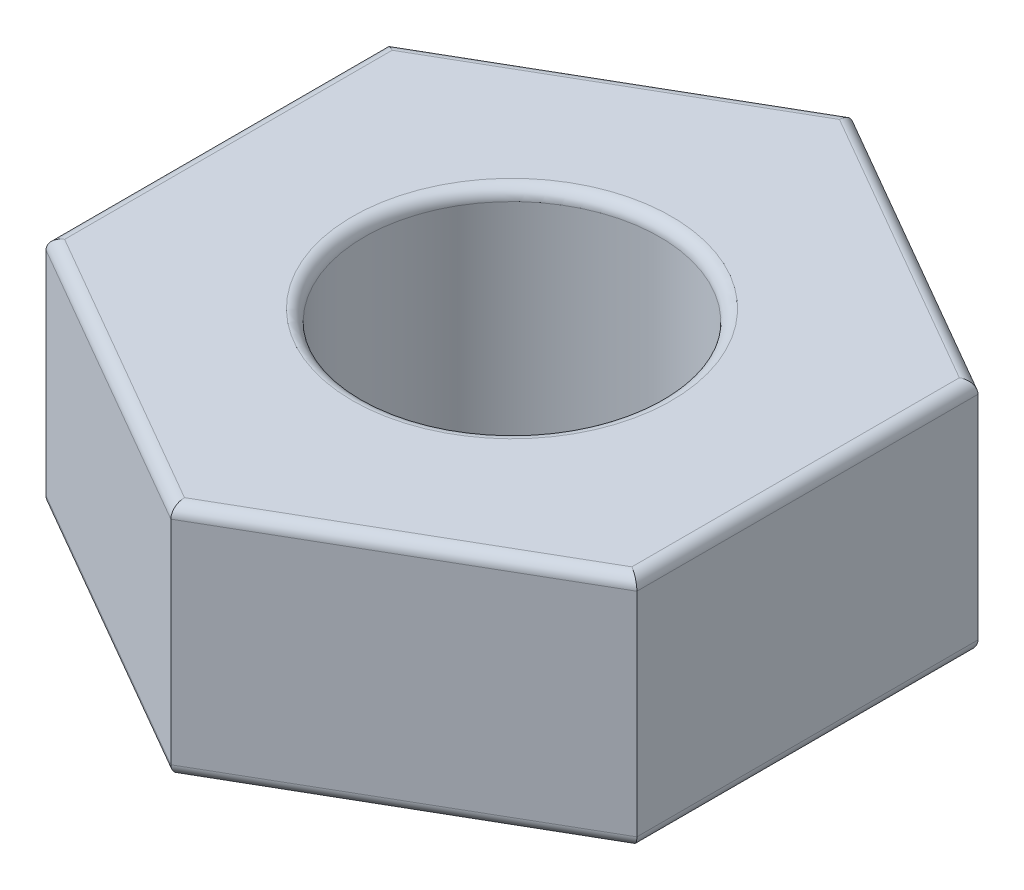
ISO-10303-21;
HEADER;
FILE_DESCRIPTION(('STEP AP214'),'2;1');
FILE_NAME('part.step','',(''),(''),'','','');
FILE_SCHEMA(('AUTOMOTIVE_DESIGN { 1 0 10303 214 1 1 1 1 }'));
ENDSEC;
DATA;
#1=APPLICATION_CONTEXT('core data for automotive mechanical design processes');
#2=APPLICATION_PROTOCOL_DEFINITION('international standard','automotive_design',2000,#1);
#3=PRODUCT_CONTEXT('',#1,'mechanical');
#4=PRODUCT('Part','Part','',(#3));
#5=PRODUCT_RELATED_PRODUCT_CATEGORY('part','',(#4));
#6=PRODUCT_DEFINITION_FORMATION('','',#4);
#7=PRODUCT_DEFINITION_CONTEXT('part definition',#1,'design');
#8=PRODUCT_DEFINITION('design','',#6,#7);
#9=PRODUCT_DEFINITION_SHAPE('','',#8);
#10=(LENGTH_UNIT() NAMED_UNIT(*) SI_UNIT(.MILLI.,.METRE.));
#11=(NAMED_UNIT(*) PLANE_ANGLE_UNIT() SI_UNIT($,.RADIAN.));
#12=(NAMED_UNIT(*) SI_UNIT($,.STERADIAN.) SOLID_ANGLE_UNIT());
#13=UNCERTAINTY_MEASURE_WITH_UNIT(LENGTH_MEASURE(1.E-05),#10,'distance_accuracy_value','');
#14=(GEOMETRIC_REPRESENTATION_CONTEXT(3) GLOBAL_UNCERTAINTY_ASSIGNED_CONTEXT((#13)) GLOBAL_UNIT_ASSIGNED_CONTEXT((#10,
#11,#12)) REPRESENTATION_CONTEXT('',''));
#15=CARTESIAN_POINT('',(0.,0.,0.));
#16=DIRECTION('',(0.,0.,1.));
#17=DIRECTION('',(1.,0.,0.));
#18=AXIS2_PLACEMENT_3D('',#15,#16,#17);
#19=CARTESIAN_POINT('',(0.,1.,0.));
#20=DIRECTION('',(0.,1.,0.));
#21=DIRECTION('',(0.,0.,1.00000000000002));
#22=AXIS2_PLACEMENT_3D('',#19,#20,#21);
#23=PLANE('',#22);
#24=CARTESIAN_POINT('',(0.,1.,0.));
#25=DIRECTION('',(0.,1.,0.));
#26=DIRECTION('',(0.,0.,1.00000000000002));
#27=AXIS2_PLACEMENT_3D('',#24,#25,#26);
#28=CIRCLE('',#27,1.35);
#29=CARTESIAN_POINT('',(0.,1.,1.35));
#30=VERTEX_POINT('',#29);
#31=EDGE_CURVE('E11',#30,#30,#28,.F.);
#32=ORIENTED_EDGE('',*,*,#31,.T.);
#33=EDGE_LOOP('',(#32));
#34=FACE_BOUND('',#33,.T.);
#35=DIRECTION('',(0.866025403784454,0.,-0.500000000000009));
#36=VECTOR('',#35,1.);
#37=CARTESIAN_POINT('',(2.45000000000027,1.,1.35677313259578));
#38=LINE('',#37,#36);
#39=CARTESIAN_POINT('',(1.11022302462516E-13,1.,2.77128129211041));
#40=VERTEX_POINT('',#39);
#41=CARTESIAN_POINT('',(2.4,1.,1.38564064605522));
#42=VERTEX_POINT('',#41);
#43=EDGE_CURVE('E49',#40,#42,#38,.T.);
#44=ORIENTED_EDGE('',*,*,#43,.T.);
#45=DIRECTION('',(0.,0.,-1.00000000000002));
#46=VECTOR('',#45,1.);
#47=CARTESIAN_POINT('',(2.4000000000001,1.00000000000001,-1.44337567297394));
#48=LINE('',#47,#46);
#49=CARTESIAN_POINT('',(2.40000000000003,1.00000000000001,-1.38564064605515));
#50=VERTEX_POINT('',#49);
#51=EDGE_CURVE('E41',#42,#50,#48,.T.);
#52=ORIENTED_EDGE('',*,*,#51,.T.);
#53=DIRECTION('',(-0.866025403784454,0.,-0.500000000000008));
#54=VECTOR('',#53,1.);
#55=CARTESIAN_POINT('',(-0.0499999999999806,1.00000000000001,-2.80014880556975));
#56=LINE('',#55,#54);
#57=CARTESIAN_POINT('',(1.80411241501588E-13,1.00000000000001,-2.77128129211025));
#58=VERTEX_POINT('',#57);
#59=EDGE_CURVE('E188',#50,#58,#56,.T.);
#60=ORIENTED_EDGE('',*,*,#59,.T.);
#61=DIRECTION('',(-0.866025403784454,0.,0.500000000000009));
#62=VECTOR('',#61,1.);
#63=CARTESIAN_POINT('',(-2.45000000000013,1.00000000000001,-1.35677313259554));
#64=LINE('',#63,#62);
#65=CARTESIAN_POINT('',(-2.40000000000022,1.00000000000001,-1.38564064605508));
#66=VERTEX_POINT('',#65);
#67=EDGE_CURVE('E190',#58,#66,#64,.T.);
#68=ORIENTED_EDGE('',*,*,#67,.T.);
#69=DIRECTION('',(0.,0.,1.00000000000002));
#70=VECTOR('',#69,1.);
#71=CARTESIAN_POINT('',(-2.40000000000003,1.,1.44337567297421));
#72=LINE('',#71,#70);
#73=CARTESIAN_POINT('',(-2.39999999999999,1.,1.38564064605519));
#74=VERTEX_POINT('',#73);
#75=EDGE_CURVE('E192',#66,#74,#72,.T.);
#76=ORIENTED_EDGE('',*,*,#75,.T.);
#77=DIRECTION('',(0.866025403784454,0.,0.500000000000009));
#78=VECTOR('',#77,1.);
#79=CARTESIAN_POINT('',(0.05000000000005,1.,2.80014880556985));
#80=LINE('',#79,#78);
#81=EDGE_CURVE('E54',#74,#40,#80,.T.);
#82=ORIENTED_EDGE('',*,*,#81,.T.);
#83=EDGE_LOOP('',(#44,#52,#60,#68,#76,#82));
#84=FACE_BOUND('',#83,.T.);
#85=ADVANCED_FACE('F32',(#34,#84),#23,.T.);
#86=CARTESIAN_POINT('',(0.,-1.,0.));
#87=DIRECTION('',(0.,1.,0.));
#88=DIRECTION('',(0.,0.,1.00000000000002));
#89=AXIS2_PLACEMENT_3D('',#86,#87,#88);
#90=PLANE('',#89);
#91=CARTESIAN_POINT('',(0.,-1.,0.));
#92=DIRECTION('',(0.,1.,0.));
#93=DIRECTION('',(0.,0.,1.00000000000002));
#94=AXIS2_PLACEMENT_3D('',#91,#92,#93);
#95=CIRCLE('',#94,1.35);
#96=CARTESIAN_POINT('',(0.,-1.,1.35000000000002));
#97=VERTEX_POINT('',#96);
#98=EDGE_CURVE('E150',#97,#97,#95,.T.);
#99=ORIENTED_EDGE('',*,*,#98,.T.);
#100=EDGE_LOOP('',(#99));
#101=FACE_BOUND('',#100,.T.);
#102=DIRECTION('',(0.,0.,1.00000000000002));
#103=VECTOR('',#102,1.);
#104=CARTESIAN_POINT('',(-2.4,-1.,0.));
#105=LINE('',#104,#103);
#106=CARTESIAN_POINT('',(-2.40000000000001,-1.,1.38564064605537));
#107=VERTEX_POINT('',#106);
#108=CARTESIAN_POINT('',(-2.40000000000011,-0.999999999999987,-1.38564064605511));
#109=VERTEX_POINT('',#108);
#110=EDGE_CURVE('E149',#107,#109,#105,.F.);
#111=ORIENTED_EDGE('',*,*,#110,.T.);
#112=DIRECTION('',(-0.866025403784454,0.,0.500000000000009));
#113=VECTOR('',#112,1.);
#114=CARTESIAN_POINT('',(-1.19999999999997,-1.00000000000004,-2.07846096908253));
#115=LINE('',#114,#113);
#116=CARTESIAN_POINT('',(0.,-0.999999999999987,-2.77128129211014));
#117=VERTEX_POINT('',#116);
#118=EDGE_CURVE('E128',#109,#117,#115,.F.);
#119=ORIENTED_EDGE('',*,*,#118,.T.);
#120=DIRECTION('',(-0.866025403784454,0.,-0.500000000000008));
#121=VECTOR('',#120,1.);
#122=CARTESIAN_POINT('',(1.20000000000009,-0.999999999999994,-2.07846096908262));
#123=LINE('',#122,#121);
#124=CARTESIAN_POINT('',(2.40000000000015,-0.999999999999994,-1.38564064605509));
#125=VERTEX_POINT('',#124);
#126=EDGE_CURVE('E138',#117,#125,#123,.F.);
#127=ORIENTED_EDGE('',*,*,#126,.T.);
#128=DIRECTION('',(0.,0.,-1.00000000000002));
#129=VECTOR('',#128,1.);
#130=CARTESIAN_POINT('',(2.40000000000017,-1.,0.));
#131=LINE('',#130,#129);
#132=CARTESIAN_POINT('',(2.39999999999999,-1.,1.38564064605524));
#133=VERTEX_POINT('',#132);
#134=EDGE_CURVE('E144',#125,#133,#131,.F.);
#135=ORIENTED_EDGE('',*,*,#134,.T.);
#136=DIRECTION('',(0.866025403784454,0.,-0.500000000000009));
#137=VECTOR('',#136,1.);
#138=CARTESIAN_POINT('',(1.19999999999992,-1.,2.0784609690828));
#139=LINE('',#138,#137);
#140=CARTESIAN_POINT('',(1.11022302462516E-13,-1.,2.77128129211041));
#141=VERTEX_POINT('',#140);
#142=EDGE_CURVE('E250',#133,#141,#139,.F.);
#143=ORIENTED_EDGE('',*,*,#142,.T.);
#144=DIRECTION('',(0.866025403784454,0.,0.500000000000009));
#145=VECTOR('',#144,1.);
#146=CARTESIAN_POINT('',(-1.19999999999992,-1.,2.07846096908278));
#147=LINE('',#146,#145);
#148=EDGE_CURVE('E155',#141,#107,#147,.F.);
#149=ORIENTED_EDGE('',*,*,#148,.T.);
#150=EDGE_LOOP('',(#111,#119,#127,#135,#143,#149));
#151=FACE_BOUND('',#150,.T.);
#152=ADVANCED_FACE('F147',(#101,#151),#90,.F.);
#153=CARTESIAN_POINT('',(2.50000000000002,1.00000000000001,-1.44337567297411));
#154=DIRECTION('',(-0.500000000000008,0.,0.866025403784454));
#155=DIRECTION('',(0.866025403784454,0.,0.500000000000008));
#156=AXIS2_PLACEMENT_3D('',#153,#154,#155);
#157=PLANE('',#156);
#158=DIRECTION('',(0.,-1.,0.));
#159=VECTOR('',#158,1.);
#160=CARTESIAN_POINT('',(2.50000000000002,1.00000000000001,-1.44337567297411));
#161=LINE('',#160,#159);
#162=CARTESIAN_POINT('',(2.50000000000002,0.900000000000005,-1.44337567297411));
#163=VERTEX_POINT('',#162);
#164=CARTESIAN_POINT('',(2.50000000000002,-0.899999999999991,-1.44337567297416));
#165=VERTEX_POINT('',#164);
#166=EDGE_CURVE('E207',#163,#165,#161,.T.);
#167=ORIENTED_EDGE('',*,*,#166,.T.);
#168=DIRECTION('',(-0.866025403784454,0.,-0.500000000000008));
#169=VECTOR('',#168,1.);
#170=CARTESIAN_POINT('',(2.50000000000002,-0.899999999999991,-1.44337567297416));
#171=LINE('',#170,#169);
#172=CARTESIAN_POINT('',(0.,-0.899999999999984,-2.88675134594804));
#173=VERTEX_POINT('',#172);
#174=EDGE_CURVE('E186',#165,#173,#171,.T.);
#175=ORIENTED_EDGE('',*,*,#174,.T.);
#176=DIRECTION('',(0.,-1.,0.));
#177=VECTOR('',#176,1.);
#178=CARTESIAN_POINT('',(0.,1.00000000000001,-2.88675134594804));
#179=LINE('',#178,#177);
#180=CARTESIAN_POINT('',(0.,0.900000000000012,-2.88675134594804));
#181=VERTEX_POINT('',#180);
#182=EDGE_CURVE('E145',#181,#173,#179,.T.);
#183=ORIENTED_EDGE('',*,*,#182,.F.);
#184=DIRECTION('',(-0.866025403784454,0.,-0.500000000000008));
#185=VECTOR('',#184,1.);
#186=CARTESIAN_POINT('',(2.50000000000002,0.900000000000005,-1.44337567297411));
#187=LINE('',#186,#185);
#188=EDGE_CURVE('E184',#181,#163,#187,.F.);
#189=ORIENTED_EDGE('',*,*,#188,.T.);
#190=EDGE_LOOP('',(#167,#175,#183,#189));
#191=FACE_BOUND('',#190,.T.);
#192=ADVANCED_FACE('F274',(#191),#157,.F.);
#193=CARTESIAN_POINT('',(0.,1.00000000000001,-2.88675134594804));
#194=DIRECTION('',(0.500000000000009,0.,0.866025403784454));
#195=DIRECTION('',(0.866025403784454,0.,-0.500000000000009));
#196=AXIS2_PLACEMENT_3D('',#193,#194,#195);
#197=PLANE('',#196);
#198=ORIENTED_EDGE('',*,*,#182,.T.);
#199=DIRECTION('',(-0.866025403784454,0.,0.500000000000009));
#200=VECTOR('',#199,1.);
#201=CARTESIAN_POINT('',(0.,-0.899999999999984,-2.88675134594804));
#202=LINE('',#201,#200);
#203=CARTESIAN_POINT('',(-2.5000000000001,-0.899999999999984,-1.4433756729741));
#204=VERTEX_POINT('',#203);
#205=EDGE_CURVE('E131',#173,#204,#202,.T.);
#206=ORIENTED_EDGE('',*,*,#205,.T.);
#207=DIRECTION('',(0.,-1.,0.));
#208=VECTOR('',#207,1.);
#209=CARTESIAN_POINT('',(-2.5000000000001,1.00000000000001,-1.4433756729741));
#210=LINE('',#209,#208);
#211=CARTESIAN_POINT('',(-2.5000000000001,0.900000000000012,-1.4433756729741));
#212=VERTEX_POINT('',#211);
#213=EDGE_CURVE('E236',#212,#204,#210,.T.);
#214=ORIENTED_EDGE('',*,*,#213,.F.);
#215=DIRECTION('',(-0.866025403784454,0.,0.500000000000009));
#216=VECTOR('',#215,1.);
#217=CARTESIAN_POINT('',(0.,0.900000000000012,-2.88675134594804));
#218=LINE('',#217,#216);
#219=EDGE_CURVE('E164',#212,#181,#218,.F.);
#220=ORIENTED_EDGE('',*,*,#219,.T.);
#221=EDGE_LOOP('',(#198,#206,#214,#220));
#222=FACE_BOUND('',#221,.T.);
#223=ADVANCED_FACE('F241',(#222),#197,.F.);
#224=CARTESIAN_POINT('',(-2.5000000000001,1.00000000000001,-1.4433756729741));
#225=DIRECTION('',(1.00000000000002,0.,0.));
#226=DIRECTION('',(0.,0.,-1.00000000000002));
#227=AXIS2_PLACEMENT_3D('',#224,#225,#226);
#228=PLANE('',#227);
#229=ORIENTED_EDGE('',*,*,#213,.T.);
#230=DIRECTION('',(0.,0.,1.00000000000002));
#231=VECTOR('',#230,1.);
#232=CARTESIAN_POINT('',(-2.5000000000001,-0.899999999999984,-1.4433756729741));
#233=LINE('',#232,#231);
#234=CARTESIAN_POINT('',(-2.50000000000007,-0.899999999999998,1.44337567297423));
#235=VERTEX_POINT('',#234);
#236=EDGE_CURVE('E169',#204,#235,#233,.T.);
#237=ORIENTED_EDGE('',*,*,#236,.T.);
#238=DIRECTION('',(0.,-1.,0.));
#239=VECTOR('',#238,1.);
#240=CARTESIAN_POINT('',(-2.50000000000007,1.,1.44337567297423));
#241=LINE('',#240,#239);
#242=CARTESIAN_POINT('',(-2.50000000000007,0.899999999999998,1.44337567297423));
#243=VERTEX_POINT('',#242);
#244=EDGE_CURVE('E238',#243,#235,#241,.T.);
#245=ORIENTED_EDGE('',*,*,#244,.F.);
#246=DIRECTION('',(0.,0.,1.00000000000002));
#247=VECTOR('',#246,1.);
#248=CARTESIAN_POINT('',(-2.5000000000001,0.900000000000012,-1.4433756729741));
#249=LINE('',#248,#247);
#250=EDGE_CURVE('E167',#243,#212,#249,.F.);
#251=ORIENTED_EDGE('',*,*,#250,.T.);
#252=EDGE_LOOP('',(#229,#237,#245,#251));
#253=FACE_BOUND('',#252,.T.);
#254=ADVANCED_FACE('F235',(#253),#228,.F.);
#255=CARTESIAN_POINT('',(-2.50000000000007,1.,1.44337567297423));
#256=DIRECTION('',(0.500000000000009,0.,-0.866025403784454));
#257=DIRECTION('',(-0.866025403784454,0.,-0.500000000000009));
#258=AXIS2_PLACEMENT_3D('',#255,#256,#257);
#259=PLANE('',#258);
#260=ORIENTED_EDGE('',*,*,#244,.T.);
#261=DIRECTION('',(0.866025403784454,0.,0.500000000000009));
#262=VECTOR('',#261,1.);
#263=CARTESIAN_POINT('',(-2.50000000000007,-0.899999999999998,1.44337567297423));
#264=LINE('',#263,#262);
#265=CARTESIAN_POINT('',(1.66533453693773E-13,-0.899999999999998,2.88675134594833));
#266=VERTEX_POINT('',#265);
#267=EDGE_CURVE('E173',#235,#266,#264,.T.);
#268=ORIENTED_EDGE('',*,*,#267,.T.);
#269=DIRECTION('',(0.,-1.,0.));
#270=VECTOR('',#269,1.);
#271=CARTESIAN_POINT('',(0.,1.,2.88675134594833));
#272=LINE('',#271,#270);
#273=CARTESIAN_POINT('',(0.,0.899999999999998,2.88675134594833));
#274=VERTEX_POINT('',#273);
#275=EDGE_CURVE('E245',#274,#266,#272,.T.);
#276=ORIENTED_EDGE('',*,*,#275,.F.);
#277=DIRECTION('',(0.866025403784454,0.,0.500000000000009));
#278=VECTOR('',#277,1.);
#279=CARTESIAN_POINT('',(-2.50000000000007,0.899999999999998,1.44337567297423));
#280=LINE('',#279,#278);
#281=EDGE_CURVE('E171',#274,#243,#280,.F.);
#282=ORIENTED_EDGE('',*,*,#281,.T.);
#283=EDGE_LOOP('',(#260,#268,#276,#282));
#284=FACE_BOUND('',#283,.T.);
#285=ADVANCED_FACE('F262',(#284),#259,.F.);
#286=CARTESIAN_POINT('',(0.,1.,2.88675134594833));
#287=DIRECTION('',(-0.500000000000008,0.,-0.866025403784455));
#288=DIRECTION('',(-0.866025403784454,0.,0.500000000000009));
#289=AXIS2_PLACEMENT_3D('',#286,#287,#288);
#290=PLANE('',#289);
#291=ORIENTED_EDGE('',*,*,#275,.T.);
#292=DIRECTION('',(0.866025403784454,0.,-0.500000000000009));
#293=VECTOR('',#292,1.);
#294=CARTESIAN_POINT('',(1.66533453693773E-13,-0.899999999999998,2.88675134594833));
#295=LINE('',#294,#293);
#296=CARTESIAN_POINT('',(2.49999999999996,-0.899999999999998,1.44337567297419));
#297=VERTEX_POINT('',#296);
#298=EDGE_CURVE('E177',#266,#297,#295,.T.);
#299=ORIENTED_EDGE('',*,*,#298,.T.);
#300=DIRECTION('',(0.,-1.,0.));
#301=VECTOR('',#300,1.);
#302=CARTESIAN_POINT('',(2.49999999999996,1.,1.44337567297423));
#303=LINE('',#302,#301);
#304=CARTESIAN_POINT('',(2.49999999999996,0.899999999999998,1.44337567297423));
#305=VERTEX_POINT('',#304);
#306=EDGE_CURVE('E267',#305,#297,#303,.T.);
#307=ORIENTED_EDGE('',*,*,#306,.F.);
#308=DIRECTION('',(0.866025403784454,0.,-0.500000000000009));
#309=VECTOR('',#308,1.);
#310=CARTESIAN_POINT('',(0.,0.899999999999998,2.88675134594833));
#311=LINE('',#310,#309);
#312=EDGE_CURVE('E175',#305,#274,#311,.F.);
#313=ORIENTED_EDGE('',*,*,#312,.T.);
#314=EDGE_LOOP('',(#291,#299,#307,#313));
#315=FACE_BOUND('',#314,.T.);
#316=ADVANCED_FACE('F285',(#315),#290,.F.);
#317=CARTESIAN_POINT('',(2.49999999999996,1.,1.44337567297423));
#318=DIRECTION('',(-1.00000000000002,0.,0.));
#319=DIRECTION('',(0.,0.,1.00000000000002));
#320=AXIS2_PLACEMENT_3D('',#317,#318,#319);
#321=PLANE('',#320);
#322=ORIENTED_EDGE('',*,*,#306,.T.);
#323=DIRECTION('',(0.,0.,-1.00000000000002));
#324=VECTOR('',#323,1.);
#325=CARTESIAN_POINT('',(2.49999999999996,-0.899999999999998,1.44337567297419));
#326=LINE('',#325,#324);
#327=EDGE_CURVE('E182',#297,#165,#326,.T.);
#328=ORIENTED_EDGE('',*,*,#327,.T.);
#329=ORIENTED_EDGE('',*,*,#166,.F.);
#330=DIRECTION('',(0.,0.,-1.00000000000002));
#331=VECTOR('',#330,1.);
#332=CARTESIAN_POINT('',(2.49999999999996,0.899999999999998,1.44337567297423));
#333=LINE('',#332,#331);
#334=EDGE_CURVE('E179',#163,#305,#333,.F.);
#335=ORIENTED_EDGE('',*,*,#334,.T.);
#336=EDGE_LOOP('',(#322,#328,#329,#335));
#337=FACE_BOUND('',#336,.T.);
#338=ADVANCED_FACE('F286',(#337),#321,.F.);
#339=CARTESIAN_POINT('',(0.,1.,0.));
#340=DIRECTION('',(0.,-1.,0.));
#341=DIRECTION('',(0.,0.,-1.00000000000002));
#342=AXIS2_PLACEMENT_3D('',#339,#340,#341);
#343=CYLINDRICAL_SURFACE('',#342,1.25);
#344=CARTESIAN_POINT('',(0.,-0.899999999999998,0.));
#345=DIRECTION('',(0.,1.,0.));
#346=DIRECTION('',(0.,0.,1.00000000000002));
#347=AXIS2_PLACEMENT_3D('',#344,#345,#346);
#348=CIRCLE('',#347,1.25);
#349=CARTESIAN_POINT('',(0.,-0.899999999999998,1.25000000000002));
#350=VERTEX_POINT('',#349);
#351=EDGE_CURVE('E161',#350,#350,#348,.F.);
#352=ORIENTED_EDGE('',*,*,#351,.T.);
#353=EDGE_LOOP('',(#352));
#354=FACE_BOUND('',#353,.T.);
#355=CARTESIAN_POINT('',(0.,0.899999999999998,0.));
#356=DIRECTION('',(0.,1.,0.));
#357=DIRECTION('',(0.,0.,1.00000000000002));
#358=AXIS2_PLACEMENT_3D('',#355,#356,#357);
#359=CIRCLE('',#358,1.25);
#360=CARTESIAN_POINT('',(0.,0.899999999999998,1.25));
#361=VERTEX_POINT('',#360);
#362=EDGE_CURVE('E153',#361,#361,#359,.T.);
#363=ORIENTED_EDGE('',*,*,#362,.T.);
#364=EDGE_LOOP('',(#363));
#365=FACE_BOUND('',#364,.T.);
#366=ADVANCED_FACE('F305',(#354,#365),#343,.F.);
#367=CARTESIAN_POINT('',(0.,-0.899999999999998,0.));
#368=DIRECTION('',(0.,1.,0.));
#369=DIRECTION('',(0.,0.,1.00000000000002));
#370=AXIS2_PLACEMENT_3D('',#367,#368,#369);
#371=TOROIDAL_SURFACE('',#370,1.35,0.1);
#372=ORIENTED_EDGE('',*,*,#351,.F.);
#373=EDGE_LOOP('',(#372));
#374=FACE_BOUND('',#373,.T.);
#375=ORIENTED_EDGE('',*,*,#98,.F.);
#376=EDGE_LOOP('',(#375));
#377=FACE_BOUND('',#376,.T.);
#378=ADVANCED_FACE('F319',(#374,#377),#371,.T.);
#379=CARTESIAN_POINT('',(-0.0499999999999251,-0.899999999999998,2.80014880556993));
#380=DIRECTION('',(0.866025403784454,0.,-0.500000000000009));
#381=DIRECTION('',(-0.500000000000008,0.,-0.866025403784455));
#382=AXIS2_PLACEMENT_3D('',#379,#380,#381);
#383=CYLINDRICAL_SURFACE('',#382,0.1);
#384=CARTESIAN_POINT('',(1.11022302462516E-13,-0.899999999999998,2.77128129211041));
#385=DIRECTION('',(1.00000000000002,0.,0.));
#386=DIRECTION('',(0.,0.,-1.00000000000002));
#387=AXIS2_PLACEMENT_3D('',#384,#385,#386);
#388=ELLIPSE('',#387,0.115470053837925,0.1);
#389=EDGE_CURVE('E201',#141,#266,#388,.F.);
#390=ORIENTED_EDGE('',*,*,#389,.F.);
#391=ORIENTED_EDGE('',*,*,#142,.F.);
#392=CARTESIAN_POINT('',(2.39999999999999,-0.899999999999998,1.38564064605524));
#393=DIRECTION('',(0.500000000000009,0.,-0.866025403784454));
#394=DIRECTION('',(-0.866025403784456,0.,-0.500000000000008));
#395=AXIS2_PLACEMENT_3D('',#392,#393,#394);
#396=ELLIPSE('',#395,0.115470053837925,0.1);
#397=EDGE_CURVE('E204',#297,#133,#396,.T.);
#398=ORIENTED_EDGE('',*,*,#397,.F.);
#399=ORIENTED_EDGE('',*,*,#298,.F.);
#400=EDGE_LOOP('',(#390,#391,#398,#399));
#401=FACE_BOUND('',#400,.T.);
#402=ADVANCED_FACE('F283',(#401),#383,.T.);
#403=CARTESIAN_POINT('',(2.40000000000018,-0.899999999999998,1.44337567297417));
#404=DIRECTION('',(0.,0.,-1.00000000000002));
#405=DIRECTION('',(-1.00000000000002,0.,0.));
#406=AXIS2_PLACEMENT_3D('',#403,#404,#405);
#407=CYLINDRICAL_SURFACE('',#406,0.1);
#408=ORIENTED_EDGE('',*,*,#397,.T.);
#409=ORIENTED_EDGE('',*,*,#134,.F.);
#410=CARTESIAN_POINT('',(2.40000000000015,-0.899999999999991,-1.38564064605509));
#411=DIRECTION('',(-0.500000000000009,0.,-0.866025403784453));
#412=DIRECTION('',(-0.866025403784454,0.,0.500000000000009));
#413=AXIS2_PLACEMENT_3D('',#410,#411,#412);
#414=ELLIPSE('',#413,0.115470053837925,0.1);
#415=EDGE_CURVE('E141',#165,#125,#414,.T.);
#416=ORIENTED_EDGE('',*,*,#415,.F.);
#417=ORIENTED_EDGE('',*,*,#327,.F.);
#418=EDGE_LOOP('',(#408,#409,#416,#417));
#419=FACE_BOUND('',#418,.T.);
#420=ADVANCED_FACE('F280',(#419),#407,.T.);
#421=CARTESIAN_POINT('',(-2.44999999999998,-0.899999999999998,1.35677313259582));
#422=DIRECTION('',(0.866025403784454,0.,0.500000000000009));
#423=DIRECTION('',(0.500000000000009,0.,-0.866025403784454));
#424=AXIS2_PLACEMENT_3D('',#421,#422,#423);
#425=CYLINDRICAL_SURFACE('',#424,0.1);
#426=ORIENTED_EDGE('',*,*,#389,.T.);
#427=ORIENTED_EDGE('',*,*,#267,.F.);
#428=CARTESIAN_POINT('',(-2.40000000000001,-0.899999999999998,1.38564064605537));
#429=DIRECTION('',(0.500000000000009,0.,0.866025403784453));
#430=DIRECTION('',(0.866025403784454,0.,-0.500000000000009));
#431=AXIS2_PLACEMENT_3D('',#428,#429,#430);
#432=ELLIPSE('',#431,0.115470053837925,0.1);
#433=EDGE_CURVE('E134',#107,#235,#432,.F.);
#434=ORIENTED_EDGE('',*,*,#433,.F.);
#435=ORIENTED_EDGE('',*,*,#148,.F.);
#436=EDGE_LOOP('',(#426,#427,#434,#435));
#437=FACE_BOUND('',#436,.T.);
#438=ADVANCED_FACE('F257',(#437),#425,.T.);
#439=CARTESIAN_POINT('',(2.45000000000005,-0.899999999999991,-1.35677313259567));
#440=DIRECTION('',(-0.866025403784454,0.,-0.500000000000008));
#441=DIRECTION('',(-0.500000000000008,0.,0.866025403784454));
#442=AXIS2_PLACEMENT_3D('',#439,#440,#441);
#443=CYLINDRICAL_SURFACE('',#442,0.1);
#444=ORIENTED_EDGE('',*,*,#415,.T.);
#445=ORIENTED_EDGE('',*,*,#126,.F.);
#446=CARTESIAN_POINT('',(0.,-0.899999999999984,-2.77128129211014));
#447=DIRECTION('',(-1.00000000000002,0.,0.));
#448=DIRECTION('',(0.,0.,-1.00000000000002));
#449=AXIS2_PLACEMENT_3D('',#446,#447,#448);
#450=ELLIPSE('',#449,0.115470053837925,0.1);
#451=EDGE_CURVE('E124',#173,#117,#450,.T.);
#452=ORIENTED_EDGE('',*,*,#451,.F.);
#453=ORIENTED_EDGE('',*,*,#174,.F.);
#454=EDGE_LOOP('',(#444,#445,#452,#453));
#455=FACE_BOUND('',#454,.T.);
#456=ADVANCED_FACE('F139',(#455),#443,.T.);
#457=CARTESIAN_POINT('',(-2.40000000000007,-0.899999999999984,-1.44337567297408));
#458=DIRECTION('',(0.,0.,1.00000000000002));
#459=DIRECTION('',(1.00000000000002,0.,0.));
#460=AXIS2_PLACEMENT_3D('',#457,#458,#459);
#461=CYLINDRICAL_SURFACE('',#460,0.1);
#462=ORIENTED_EDGE('',*,*,#433,.T.);
#463=ORIENTED_EDGE('',*,*,#236,.F.);
#464=CARTESIAN_POINT('',(-2.40000000000011,-0.899999999999984,-1.38564064605511));
#465=DIRECTION('',(-0.500000000000008,0.,0.866025403784456));
#466=DIRECTION('',(0.866025403784456,0.,0.500000000000008));
#467=AXIS2_PLACEMENT_3D('',#464,#465,#466);
#468=ELLIPSE('',#467,0.115470053837925,0.1);
#469=EDGE_CURVE('E135',#109,#204,#468,.F.);
#470=ORIENTED_EDGE('',*,*,#469,.F.);
#471=ORIENTED_EDGE('',*,*,#110,.F.);
#472=EDGE_LOOP('',(#462,#463,#470,#471));
#473=FACE_BOUND('',#472,.T.);
#474=ADVANCED_FACE('F260',(#473),#461,.T.);
#475=CARTESIAN_POINT('',(0.0500000000000084,-0.899999999999984,-2.80014880556963));
#476=DIRECTION('',(-0.866025403784454,0.,0.500000000000009));
#477=DIRECTION('',(0.500000000000009,0.,0.866025403784454));
#478=AXIS2_PLACEMENT_3D('',#475,#476,#477);
#479=CYLINDRICAL_SURFACE('',#478,0.1);
#480=ORIENTED_EDGE('',*,*,#451,.T.);
#481=ORIENTED_EDGE('',*,*,#118,.F.);
#482=ORIENTED_EDGE('',*,*,#469,.T.);
#483=ORIENTED_EDGE('',*,*,#205,.F.);
#484=EDGE_LOOP('',(#480,#481,#482,#483));
#485=FACE_BOUND('',#484,.T.);
#486=ADVANCED_FACE('F126',(#485),#479,.T.);
#487=CARTESIAN_POINT('',(0.,0.899999999999998,0.));
#488=DIRECTION('',(0.,1.,0.));
#489=DIRECTION('',(0.,0.,1.00000000000002));
#490=AXIS2_PLACEMENT_3D('',#487,#488,#489);
#491=TOROIDAL_SURFACE('',#490,1.35,0.1);
#492=ORIENTED_EDGE('',*,*,#31,.F.);
#493=EDGE_LOOP('',(#492));
#494=FACE_BOUND('',#493,.T.);
#495=ORIENTED_EDGE('',*,*,#362,.F.);
#496=EDGE_LOOP('',(#495));
#497=FACE_BOUND('',#496,.T.);
#498=ADVANCED_FACE('F325',(#494,#497),#491,.T.);
#499=CARTESIAN_POINT('',(-2.40000000000022,0.899999999999998,2.28983498828939E-13));
#500=DIRECTION('',(0.,0.,-1.00000000000002));
#501=DIRECTION('',(-1.00000000000002,0.,0.));
#502=AXIS2_PLACEMENT_3D('',#499,#500,#501);
#503=CYLINDRICAL_SURFACE('',#502,0.1);
#504=CARTESIAN_POINT('',(-2.40000000000022,0.900000000000012,-1.38564064605508));
#505=DIRECTION('',(0.500000000000008,0.,-0.866025403784456));
#506=DIRECTION('',(0.866025403784456,0.,0.500000000000008));
#507=AXIS2_PLACEMENT_3D('',#504,#505,#506);
#508=ELLIPSE('',#507,0.115470053837925,0.1);
#509=EDGE_CURVE('E217',#212,#66,#508,.T.);
#510=ORIENTED_EDGE('',*,*,#509,.F.);
#511=ORIENTED_EDGE('',*,*,#250,.F.);
#512=CARTESIAN_POINT('',(-2.39999999999999,0.899999999999998,1.38564064605519));
#513=DIRECTION('',(-0.500000000000009,0.,-0.866025403784453));
#514=DIRECTION('',(0.866025403784454,0.,-0.500000000000009));
#515=AXIS2_PLACEMENT_3D('',#512,#513,#514);
#516=ELLIPSE('',#515,0.115470053837925,0.1);
#517=EDGE_CURVE('E36',#74,#243,#516,.F.);
#518=ORIENTED_EDGE('',*,*,#517,.F.);
#519=ORIENTED_EDGE('',*,*,#75,.F.);
#520=EDGE_LOOP('',(#510,#511,#518,#519));
#521=FACE_BOUND('',#520,.T.);
#522=ADVANCED_FACE('F34',(#521),#503,.T.);
#523=CARTESIAN_POINT('',(-1.20000000000003,0.899999999999998,2.07846096908286));
#524=DIRECTION('',(-0.866025403784454,0.,-0.500000000000009));
#525=DIRECTION('',(-0.500000000000009,0.,0.866025403784454));
#526=AXIS2_PLACEMENT_3D('',#523,#524,#525);
#527=CYLINDRICAL_SURFACE('',#526,0.1);
#528=ORIENTED_EDGE('',*,*,#517,.T.);
#529=ORIENTED_EDGE('',*,*,#281,.F.);
#530=CARTESIAN_POINT('',(1.11022302462516E-13,0.899999999999998,2.77128129211041));
#531=DIRECTION('',(-1.00000000000002,0.,0.));
#532=DIRECTION('',(0.,0.,-1.00000000000002));
#533=AXIS2_PLACEMENT_3D('',#530,#531,#532);
#534=ELLIPSE('',#533,0.115470053837925,0.1);
#535=EDGE_CURVE('E215',#40,#274,#534,.F.);
#536=ORIENTED_EDGE('',*,*,#535,.F.);
#537=ORIENTED_EDGE('',*,*,#81,.F.);
#538=EDGE_LOOP('',(#528,#529,#536,#537));
#539=FACE_BOUND('',#538,.T.);
#540=ADVANCED_FACE('F227',(#539),#527,.T.);
#541=CARTESIAN_POINT('',(-1.19999999999985,0.899999999999963,-2.07846096908267));
#542=DIRECTION('',(0.866025403784454,0.,-0.500000000000009));
#543=DIRECTION('',(-0.500000000000009,0.,-0.866025403784454));
#544=AXIS2_PLACEMENT_3D('',#541,#542,#543);
#545=CYLINDRICAL_SURFACE('',#544,0.1);
#546=ORIENTED_EDGE('',*,*,#509,.T.);
#547=ORIENTED_EDGE('',*,*,#67,.F.);
#548=CARTESIAN_POINT('',(1.80411241501588E-13,0.900000000000012,-2.77128129211025));
#549=DIRECTION('',(1.00000000000002,0.,0.));
#550=DIRECTION('',(0.,0.,1.00000000000002));
#551=AXIS2_PLACEMENT_3D('',#548,#549,#550);
#552=ELLIPSE('',#551,0.115470053837925,0.1);
#553=EDGE_CURVE('E212',#181,#58,#552,.T.);
#554=ORIENTED_EDGE('',*,*,#553,.F.);
#555=ORIENTED_EDGE('',*,*,#219,.F.);
#556=EDGE_LOOP('',(#546,#547,#554,#555));
#557=FACE_BOUND('',#556,.T.);
#558=ADVANCED_FACE('F346',(#557),#545,.T.);
#559=CARTESIAN_POINT('',(1.19999999999995,0.899999999999998,2.07846096908273));
#560=DIRECTION('',(-0.866025403784454,0.,0.500000000000009));
#561=DIRECTION('',(0.500000000000008,0.,0.866025403784455));
#562=AXIS2_PLACEMENT_3D('',#559,#560,#561);
#563=CYLINDRICAL_SURFACE('',#562,0.1);
#564=ORIENTED_EDGE('',*,*,#535,.T.);
#565=ORIENTED_EDGE('',*,*,#312,.F.);
#566=CARTESIAN_POINT('',(2.4,0.899999999999998,1.38564064605522));
#567=DIRECTION('',(-0.500000000000009,0.,0.866025403784454));
#568=DIRECTION('',(-0.866025403784456,0.,-0.500000000000008));
#569=AXIS2_PLACEMENT_3D('',#566,#567,#568);
#570=ELLIPSE('',#569,0.115470053837925,0.1);
#571=EDGE_CURVE('E210',#42,#305,#570,.F.);
#572=ORIENTED_EDGE('',*,*,#571,.F.);
#573=ORIENTED_EDGE('',*,*,#43,.F.);
#574=EDGE_LOOP('',(#564,#565,#572,#573));
#575=FACE_BOUND('',#574,.T.);
#576=ADVANCED_FACE('F343',(#575),#563,.T.);
#577=CARTESIAN_POINT('',(1.20000000000008,0.900000000000019,-2.07846096908267));
#578=DIRECTION('',(0.866025403784454,0.,0.500000000000008));
#579=DIRECTION('',(0.500000000000008,0.,-0.866025403784454));
#580=AXIS2_PLACEMENT_3D('',#577,#578,#579);
#581=CYLINDRICAL_SURFACE('',#580,0.1);
#582=ORIENTED_EDGE('',*,*,#553,.T.);
#583=ORIENTED_EDGE('',*,*,#59,.F.);
#584=CARTESIAN_POINT('',(2.40000000000003,0.900000000000005,-1.38564064605515));
#585=DIRECTION('',(0.500000000000009,0.,0.866025403784453));
#586=DIRECTION('',(0.866025403784454,0.,-0.500000000000009));
#587=AXIS2_PLACEMENT_3D('',#584,#585,#586);
#588=ELLIPSE('',#587,0.115470053837925,0.1);
#589=EDGE_CURVE('E208',#163,#50,#588,.T.);
#590=ORIENTED_EDGE('',*,*,#589,.F.);
#591=ORIENTED_EDGE('',*,*,#188,.F.);
#592=EDGE_LOOP('',(#582,#583,#590,#591));
#593=FACE_BOUND('',#592,.T.);
#594=ADVANCED_FACE('F294',(#593),#581,.T.);
#595=CARTESIAN_POINT('',(2.40000000000019,0.899999999999998,0.));
#596=DIRECTION('',(0.,0.,1.00000000000002));
#597=DIRECTION('',(1.00000000000002,0.,0.));
#598=AXIS2_PLACEMENT_3D('',#595,#596,#597);
#599=CYLINDRICAL_SURFACE('',#598,0.1);
#600=ORIENTED_EDGE('',*,*,#571,.T.);
#601=ORIENTED_EDGE('',*,*,#334,.F.);
#602=ORIENTED_EDGE('',*,*,#589,.T.);
#603=ORIENTED_EDGE('',*,*,#51,.F.);
#604=EDGE_LOOP('',(#600,#601,#602,#603));
#605=FACE_BOUND('',#604,.T.);
#606=ADVANCED_FACE('F289',(#605),#599,.T.);
#607=CLOSED_SHELL('',(#85,#152,#192,#223,#254,#285,#316,#338,#366,#378,#402,#420,#438,#456,#474,
#486,#498,#522,#540,#558,#576,#594,#606));
#608=MANIFOLD_SOLID_BREP('B2',#607);
#609=ADVANCED_BREP_SHAPE_REPRESENTATION('',(#18,#608),#14);
#610=SHAPE_DEFINITION_REPRESENTATION(#9,#609);
ENDSEC;
END-ISO-10303-21;
